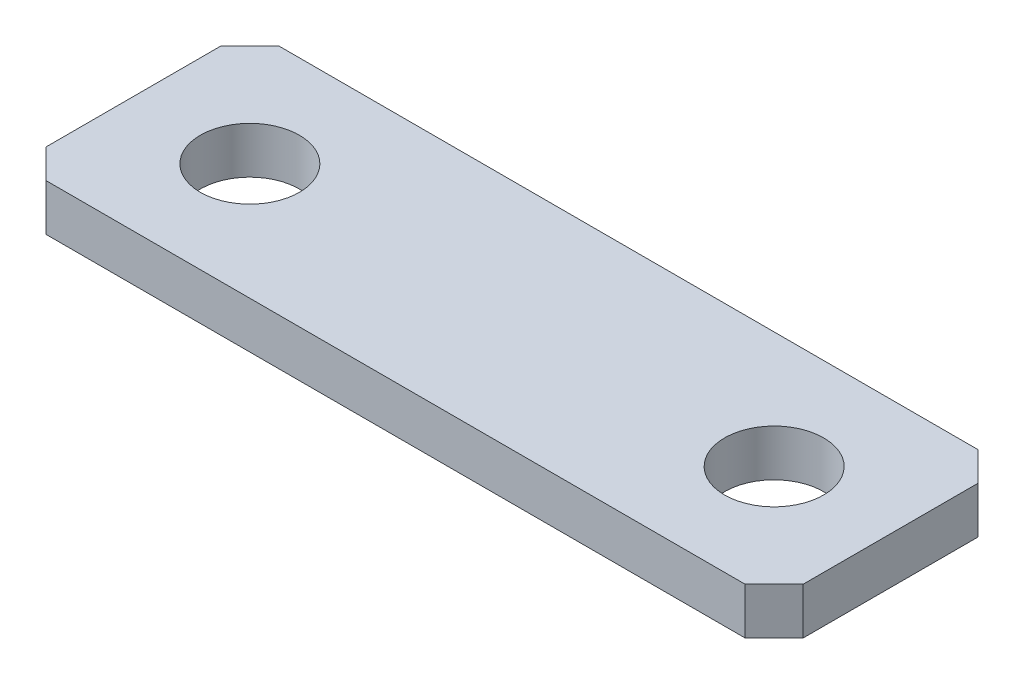
ISO-10303-21;
HEADER;
FILE_DESCRIPTION(('STEP AP214'),'2;1');
FILE_NAME('part.step','',(''),(''),'','','');
FILE_SCHEMA(('AUTOMOTIVE_DESIGN { 1 0 10303 214 1 1 1 1 }'));
ENDSEC;
DATA;
#1=APPLICATION_CONTEXT('core data for automotive mechanical design processes');
#2=APPLICATION_PROTOCOL_DEFINITION('international standard','automotive_design',2000,#1);
#3=PRODUCT_CONTEXT('',#1,'mechanical');
#4=PRODUCT('Part','Part','',(#3));
#5=PRODUCT_RELATED_PRODUCT_CATEGORY('part','',(#4));
#6=PRODUCT_DEFINITION_FORMATION('','',#4);
#7=PRODUCT_DEFINITION_CONTEXT('part definition',#1,'design');
#8=PRODUCT_DEFINITION('design','',#6,#7);
#9=PRODUCT_DEFINITION_SHAPE('','',#8);
#10=(LENGTH_UNIT() NAMED_UNIT(*) SI_UNIT(.MILLI.,.METRE.));
#11=(NAMED_UNIT(*) PLANE_ANGLE_UNIT() SI_UNIT($,.RADIAN.));
#12=(NAMED_UNIT(*) SI_UNIT($,.STERADIAN.) SOLID_ANGLE_UNIT());
#13=UNCERTAINTY_MEASURE_WITH_UNIT(LENGTH_MEASURE(1.E-05),#10,'distance_accuracy_value','');
#14=(GEOMETRIC_REPRESENTATION_CONTEXT(3) GLOBAL_UNCERTAINTY_ASSIGNED_CONTEXT((#13)) GLOBAL_UNIT_ASSIGNED_CONTEXT((#10,
#11,#12)) REPRESENTATION_CONTEXT('',''));
#15=CARTESIAN_POINT('',(0.,0.,0.));
#16=DIRECTION('',(0.,0.,1.));
#17=DIRECTION('',(1.,0.,0.));
#18=AXIS2_PLACEMENT_3D('',#15,#16,#17);
#19=CARTESIAN_POINT('',(0.,8.,0.));
#20=DIRECTION('',(0.,-1.,0.));
#21=DIRECTION('',(0.,0.,-1.));
#22=AXIS2_PLACEMENT_3D('',#19,#20,#21);
#23=PLANE('',#22);
#24=CARTESIAN_POINT('',(20.,8.,-20.));
#25=DIRECTION('',(0.,1.,0.));
#26=DIRECTION('',(0.,0.,1.));
#27=AXIS2_PLACEMENT_3D('',#24,#25,#26);
#28=CIRCLE('',#27,8.5);
#29=CARTESIAN_POINT('',(20.,8.,-11.5));
#30=VERTEX_POINT('',#29);
#31=EDGE_CURVE('E128',#30,#30,#28,.T.);
#32=ORIENTED_EDGE('',*,*,#31,.F.);
#33=EDGE_LOOP('',(#32));
#34=FACE_BOUND('',#33,.T.);
#35=DIRECTION('',(-1.,0.,0.));
#36=VECTOR('',#35,1.);
#37=CARTESIAN_POINT('',(0.,8.,-40.));
#38=LINE('',#37,#36);
#39=CARTESIAN_POINT('',(125.,8.,-40.));
#40=VERTEX_POINT('',#39);
#41=CARTESIAN_POINT('',(5.00000000000002,8.,-40.));
#42=VERTEX_POINT('',#41);
#43=EDGE_CURVE('E137',#40,#42,#38,.T.);
#44=ORIENTED_EDGE('',*,*,#43,.T.);
#45=DIRECTION('',(0.70710678118655,0.,-0.707106781186546));
#46=VECTOR('',#45,1.);
#47=CARTESIAN_POINT('',(0.,8.,-35.));
#48=LINE('',#47,#46);
#49=CARTESIAN_POINT('',(0.,8.,-35.));
#50=VERTEX_POINT('',#49);
#51=EDGE_CURVE('E156',#42,#50,#48,.F.);
#52=ORIENTED_EDGE('',*,*,#51,.T.);
#53=DIRECTION('',(0.,0.,1.));
#54=VECTOR('',#53,1.);
#55=CARTESIAN_POINT('',(0.,8.,0.));
#56=LINE('',#55,#54);
#57=CARTESIAN_POINT('',(0.,8.,-5.00000000000003));
#58=VERTEX_POINT('',#57);
#59=EDGE_CURVE('E120',#50,#58,#56,.T.);
#60=ORIENTED_EDGE('',*,*,#59,.T.);
#61=DIRECTION('',(-0.707106781186547,0.,-0.707106781186549));
#62=VECTOR('',#61,1.);
#63=CARTESIAN_POINT('',(5.00000000000002,8.,0.));
#64=LINE('',#63,#62);
#65=CARTESIAN_POINT('',(5.00000000000002,8.,0.));
#66=VERTEX_POINT('',#65);
#67=EDGE_CURVE('E151',#58,#66,#64,.F.);
#68=ORIENTED_EDGE('',*,*,#67,.T.);
#69=DIRECTION('',(1.,0.,0.));
#70=VECTOR('',#69,1.);
#71=CARTESIAN_POINT('',(0.,8.,0.));
#72=LINE('',#71,#70);
#73=CARTESIAN_POINT('',(125.,8.,0.));
#74=VERTEX_POINT('',#73);
#75=EDGE_CURVE('E167',#66,#74,#72,.T.);
#76=ORIENTED_EDGE('',*,*,#75,.T.);
#77=DIRECTION('',(-0.707106781186549,0.,0.707106781186547));
#78=VECTOR('',#77,1.);
#79=CARTESIAN_POINT('',(130.,8.,-5.00000000000002));
#80=LINE('',#79,#78);
#81=CARTESIAN_POINT('',(130.,8.,-5.00000000000002));
#82=VERTEX_POINT('',#81);
#83=EDGE_CURVE('E56',#74,#82,#80,.F.);
#84=ORIENTED_EDGE('',*,*,#83,.T.);
#85=DIRECTION('',(0.,0.,-1.));
#86=VECTOR('',#85,1.);
#87=CARTESIAN_POINT('',(130.,8.,0.));
#88=LINE('',#87,#86);
#89=CARTESIAN_POINT('',(130.,8.,-35.));
#90=VERTEX_POINT('',#89);
#91=EDGE_CURVE('E175',#82,#90,#88,.T.);
#92=ORIENTED_EDGE('',*,*,#91,.T.);
#93=DIRECTION('',(0.707106781186545,0.,0.70710678118655));
#94=VECTOR('',#93,1.);
#95=CARTESIAN_POINT('',(125.,8.,-40.));
#96=LINE('',#95,#94);
#97=EDGE_CURVE('E154',#90,#40,#96,.F.);
#98=ORIENTED_EDGE('',*,*,#97,.T.);
#99=EDGE_LOOP('',(#44,#52,#60,#68,#76,#84,#92,#98));
#100=FACE_BOUND('',#99,.T.);
#101=CARTESIAN_POINT('',(110.,8.,-20.));
#102=DIRECTION('',(0.,1.,0.));
#103=DIRECTION('',(0.,0.,1.));
#104=AXIS2_PLACEMENT_3D('',#101,#102,#103);
#105=CIRCLE('',#104,8.50000000000001);
#106=CARTESIAN_POINT('',(110.,8.,-11.5));
#107=VERTEX_POINT('',#106);
#108=EDGE_CURVE('E182',#107,#107,#105,.T.);
#109=ORIENTED_EDGE('',*,*,#108,.F.);
#110=EDGE_LOOP('',(#109));
#111=FACE_BOUND('',#110,.T.);
#112=ADVANCED_FACE('F34',(#34,#100,#111),#23,.F.);
#113=CARTESIAN_POINT('',(0.,0.,0.));
#114=DIRECTION('',(0.,-1.,0.));
#115=DIRECTION('',(0.,0.,-1.));
#116=AXIS2_PLACEMENT_3D('',#113,#114,#115);
#117=PLANE('',#116);
#118=CARTESIAN_POINT('',(20.,0.,-20.));
#119=DIRECTION('',(0.,1.,0.));
#120=DIRECTION('',(0.,0.,1.));
#121=AXIS2_PLACEMENT_3D('',#118,#119,#120);
#122=CIRCLE('',#121,8.5);
#123=CARTESIAN_POINT('',(20.,0.,-11.5));
#124=VERTEX_POINT('',#123);
#125=EDGE_CURVE('E134',#124,#124,#122,.T.);
#126=ORIENTED_EDGE('',*,*,#125,.T.);
#127=EDGE_LOOP('',(#126));
#128=FACE_BOUND('',#127,.T.);
#129=DIRECTION('',(0.,0.,1.));
#130=VECTOR('',#129,1.);
#131=CARTESIAN_POINT('',(0.,0.,0.));
#132=LINE('',#131,#130);
#133=CARTESIAN_POINT('',(0.,0.,-35.));
#134=VERTEX_POINT('',#133);
#135=CARTESIAN_POINT('',(0.,0.,-5.00000000000003));
#136=VERTEX_POINT('',#135);
#137=EDGE_CURVE('E117',#134,#136,#132,.T.);
#138=ORIENTED_EDGE('',*,*,#137,.F.);
#139=DIRECTION('',(-0.70710678118655,0.,0.707106781186546));
#140=VECTOR('',#139,1.);
#141=CARTESIAN_POINT('',(-17.5,0.,-17.5000000000001));
#142=LINE('',#141,#140);
#143=CARTESIAN_POINT('',(5.00000000000002,0.,-40.));
#144=VERTEX_POINT('',#143);
#145=EDGE_CURVE('E100',#134,#144,#142,.F.);
#146=ORIENTED_EDGE('',*,*,#145,.T.);
#147=DIRECTION('',(-1.,0.,0.));
#148=VECTOR('',#147,1.);
#149=CARTESIAN_POINT('',(0.,0.,-40.));
#150=LINE('',#149,#148);
#151=CARTESIAN_POINT('',(125.,0.,-40.));
#152=VERTEX_POINT('',#151);
#153=EDGE_CURVE('E141',#152,#144,#150,.T.);
#154=ORIENTED_EDGE('',*,*,#153,.F.);
#155=DIRECTION('',(-0.707106781186545,0.,-0.70710678118655));
#156=VECTOR('',#155,1.);
#157=CARTESIAN_POINT('',(82.5000000000005,0.,-82.4999999999999));
#158=LINE('',#157,#156);
#159=CARTESIAN_POINT('',(130.,0.,-35.));
#160=VERTEX_POINT('',#159);
#161=EDGE_CURVE('E111',#152,#160,#158,.F.);
#162=ORIENTED_EDGE('',*,*,#161,.T.);
#163=DIRECTION('',(0.,0.,-1.));
#164=VECTOR('',#163,1.);
#165=CARTESIAN_POINT('',(130.,0.,0.));
#166=LINE('',#165,#164);
#167=CARTESIAN_POINT('',(130.,0.,-5.00000000000004));
#168=VERTEX_POINT('',#167);
#169=EDGE_CURVE('E131',#168,#160,#166,.T.);
#170=ORIENTED_EDGE('',*,*,#169,.F.);
#171=DIRECTION('',(0.707106781186549,0.,-0.707106781186547));
#172=VECTOR('',#171,1.);
#173=CARTESIAN_POINT('',(62.4999999999998,0.,62.5));
#174=LINE('',#173,#172);
#175=CARTESIAN_POINT('',(125.,0.,0.));
#176=VERTEX_POINT('',#175);
#177=EDGE_CURVE('E145',#168,#176,#174,.F.);
#178=ORIENTED_EDGE('',*,*,#177,.T.);
#179=DIRECTION('',(1.,0.,0.));
#180=VECTOR('',#179,1.);
#181=CARTESIAN_POINT('',(0.,0.,0.));
#182=LINE('',#181,#180);
#183=CARTESIAN_POINT('',(5.00000000000002,0.,0.));
#184=VERTEX_POINT('',#183);
#185=EDGE_CURVE('E127',#184,#176,#182,.T.);
#186=ORIENTED_EDGE('',*,*,#185,.F.);
#187=DIRECTION('',(0.707106781186547,0.,0.707106781186549));
#188=VECTOR('',#187,1.);
#189=CARTESIAN_POINT('',(2.50000000000002,0.,-2.50000000000001));
#190=LINE('',#189,#188);
#191=EDGE_CURVE('E121',#184,#136,#190,.F.);
#192=ORIENTED_EDGE('',*,*,#191,.T.);
#193=EDGE_LOOP('',(#138,#146,#154,#162,#170,#178,#186,#192));
#194=FACE_BOUND('',#193,.T.);
#195=CARTESIAN_POINT('',(110.,0.,-20.));
#196=DIRECTION('',(0.,1.,0.));
#197=DIRECTION('',(0.,0.,1.));
#198=AXIS2_PLACEMENT_3D('',#195,#196,#197);
#199=CIRCLE('',#198,8.50000000000001);
#200=CARTESIAN_POINT('',(110.,0.,-11.5));
#201=VERTEX_POINT('',#200);
#202=EDGE_CURVE('E184',#201,#201,#199,.T.);
#203=ORIENTED_EDGE('',*,*,#202,.T.);
#204=EDGE_LOOP('',(#203));
#205=FACE_BOUND('',#204,.T.);
#206=ADVANCED_FACE('F124',(#128,#194,#205),#117,.T.);
#207=CARTESIAN_POINT('',(0.,8.,0.));
#208=DIRECTION('',(1.,0.,0.));
#209=DIRECTION('',(0.,0.,-1.));
#210=AXIS2_PLACEMENT_3D('',#207,#208,#209);
#211=PLANE('',#210);
#212=ORIENTED_EDGE('',*,*,#59,.F.);
#213=DIRECTION('',(0.,-1.,0.));
#214=VECTOR('',#213,1.);
#215=CARTESIAN_POINT('',(0.,8.,-35.));
#216=LINE('',#215,#214);
#217=EDGE_CURVE('E104',#50,#134,#216,.T.);
#218=ORIENTED_EDGE('',*,*,#217,.T.);
#219=ORIENTED_EDGE('',*,*,#137,.T.);
#220=DIRECTION('',(0.,1.,0.));
#221=VECTOR('',#220,1.);
#222=CARTESIAN_POINT('',(0.,8.,-5.00000000000003));
#223=LINE('',#222,#221);
#224=EDGE_CURVE('E122',#136,#58,#223,.T.);
#225=ORIENTED_EDGE('',*,*,#224,.T.);
#226=EDGE_LOOP('',(#212,#218,#219,#225));
#227=FACE_BOUND('',#226,.T.);
#228=ADVANCED_FACE('F116',(#227),#211,.F.);
#229=CARTESIAN_POINT('',(0.,8.,0.));
#230=DIRECTION('',(0.,0.,-1.));
#231=DIRECTION('',(-1.,0.,0.));
#232=AXIS2_PLACEMENT_3D('',#229,#230,#231);
#233=PLANE('',#232);
#234=ORIENTED_EDGE('',*,*,#185,.T.);
#235=DIRECTION('',(0.,1.,0.));
#236=VECTOR('',#235,1.);
#237=CARTESIAN_POINT('',(125.,8.,0.));
#238=LINE('',#237,#236);
#239=EDGE_CURVE('E11',#176,#74,#238,.T.);
#240=ORIENTED_EDGE('',*,*,#239,.T.);
#241=ORIENTED_EDGE('',*,*,#75,.F.);
#242=DIRECTION('',(0.,-1.,0.));
#243=VECTOR('',#242,1.);
#244=CARTESIAN_POINT('',(5.00000000000002,8.,0.));
#245=LINE('',#244,#243);
#246=EDGE_CURVE('E42',#66,#184,#245,.T.);
#247=ORIENTED_EDGE('',*,*,#246,.T.);
#248=EDGE_LOOP('',(#234,#240,#241,#247));
#249=FACE_BOUND('',#248,.T.);
#250=ADVANCED_FACE('F165',(#249),#233,.F.);
#251=CARTESIAN_POINT('',(130.,8.,0.));
#252=DIRECTION('',(-1.,0.,0.));
#253=DIRECTION('',(0.,0.,1.));
#254=AXIS2_PLACEMENT_3D('',#251,#252,#253);
#255=PLANE('',#254);
#256=ORIENTED_EDGE('',*,*,#169,.T.);
#257=DIRECTION('',(0.,1.,0.));
#258=VECTOR('',#257,1.);
#259=CARTESIAN_POINT('',(130.,8.,-35.));
#260=LINE('',#259,#258);
#261=EDGE_CURVE('E49',#160,#90,#260,.T.);
#262=ORIENTED_EDGE('',*,*,#261,.T.);
#263=ORIENTED_EDGE('',*,*,#91,.F.);
#264=DIRECTION('',(0.,-1.,0.));
#265=VECTOR('',#264,1.);
#266=CARTESIAN_POINT('',(130.,8.,-5.00000000000002));
#267=LINE('',#266,#265);
#268=EDGE_CURVE('E158',#82,#168,#267,.T.);
#269=ORIENTED_EDGE('',*,*,#268,.T.);
#270=EDGE_LOOP('',(#256,#262,#263,#269));
#271=FACE_BOUND('',#270,.T.);
#272=ADVANCED_FACE('F174',(#271),#255,.F.);
#273=CARTESIAN_POINT('',(0.,8.,-40.));
#274=DIRECTION('',(0.,0.,1.));
#275=DIRECTION('',(1.,0.,0.));
#276=AXIS2_PLACEMENT_3D('',#273,#274,#275);
#277=PLANE('',#276);
#278=ORIENTED_EDGE('',*,*,#153,.T.);
#279=DIRECTION('',(0.,1.,0.));
#280=VECTOR('',#279,1.);
#281=CARTESIAN_POINT('',(5.00000000000002,8.,-40.));
#282=LINE('',#281,#280);
#283=EDGE_CURVE('E105',#144,#42,#282,.T.);
#284=ORIENTED_EDGE('',*,*,#283,.T.);
#285=ORIENTED_EDGE('',*,*,#43,.F.);
#286=DIRECTION('',(0.,-1.,0.));
#287=VECTOR('',#286,1.);
#288=CARTESIAN_POINT('',(125.,8.,-40.));
#289=LINE('',#288,#287);
#290=EDGE_CURVE('E110',#40,#152,#289,.T.);
#291=ORIENTED_EDGE('',*,*,#290,.T.);
#292=EDGE_LOOP('',(#278,#284,#285,#291));
#293=FACE_BOUND('',#292,.T.);
#294=ADVANCED_FACE('F206',(#293),#277,.F.);
#295=CARTESIAN_POINT('',(20.,8.,-20.));
#296=DIRECTION('',(0.,-1.,0.));
#297=DIRECTION('',(0.,0.,-1.));
#298=AXIS2_PLACEMENT_3D('',#295,#296,#297);
#299=CYLINDRICAL_SURFACE('',#298,8.5);
#300=ORIENTED_EDGE('',*,*,#31,.T.);
#301=EDGE_LOOP('',(#300));
#302=FACE_BOUND('',#301,.T.);
#303=ORIENTED_EDGE('',*,*,#125,.F.);
#304=EDGE_LOOP('',(#303));
#305=FACE_BOUND('',#304,.T.);
#306=ADVANCED_FACE('F203',(#302,#305),#299,.F.);
#307=CARTESIAN_POINT('',(110.,8.,-20.));
#308=DIRECTION('',(0.,-1.,0.));
#309=DIRECTION('',(0.,0.,-1.));
#310=AXIS2_PLACEMENT_3D('',#307,#308,#309);
#311=CYLINDRICAL_SURFACE('',#310,8.50000000000001);
#312=ORIENTED_EDGE('',*,*,#108,.T.);
#313=EDGE_LOOP('',(#312));
#314=FACE_BOUND('',#313,.T.);
#315=ORIENTED_EDGE('',*,*,#202,.F.);
#316=EDGE_LOOP('',(#315));
#317=FACE_BOUND('',#316,.T.);
#318=ADVANCED_FACE('F190',(#314,#317),#311,.F.);
#319=CARTESIAN_POINT('',(0.,8.,-35.));
#320=DIRECTION('',(0.707106781186545,0.,0.707106781186549));
#321=DIRECTION('',(0.,-1.,0.));
#322=AXIS2_PLACEMENT_3D('',#319,#320,#321);
#323=PLANE('',#322);
#324=ORIENTED_EDGE('',*,*,#51,.F.);
#325=ORIENTED_EDGE('',*,*,#283,.F.);
#326=ORIENTED_EDGE('',*,*,#145,.F.);
#327=ORIENTED_EDGE('',*,*,#217,.F.);
#328=EDGE_LOOP('',(#324,#325,#326,#327));
#329=FACE_BOUND('',#328,.T.);
#330=ADVANCED_FACE('F103',(#329),#323,.F.);
#331=CARTESIAN_POINT('',(125.,8.,-40.));
#332=DIRECTION('',(-0.70710678118655,0.,0.707106781186545));
#333=DIRECTION('',(0.,-1.,0.));
#334=AXIS2_PLACEMENT_3D('',#331,#332,#333);
#335=PLANE('',#334);
#336=ORIENTED_EDGE('',*,*,#97,.F.);
#337=ORIENTED_EDGE('',*,*,#261,.F.);
#338=ORIENTED_EDGE('',*,*,#161,.F.);
#339=ORIENTED_EDGE('',*,*,#290,.F.);
#340=EDGE_LOOP('',(#336,#337,#338,#339));
#341=FACE_BOUND('',#340,.T.);
#342=ADVANCED_FACE('F218',(#341),#335,.F.);
#343=CARTESIAN_POINT('',(130.,8.,-5.00000000000002));
#344=DIRECTION('',(-0.707106781186546,0.,-0.707106781186548));
#345=DIRECTION('',(0.,-1.,0.));
#346=AXIS2_PLACEMENT_3D('',#343,#344,#345);
#347=PLANE('',#346);
#348=ORIENTED_EDGE('',*,*,#83,.F.);
#349=ORIENTED_EDGE('',*,*,#239,.F.);
#350=ORIENTED_EDGE('',*,*,#177,.F.);
#351=ORIENTED_EDGE('',*,*,#268,.F.);
#352=EDGE_LOOP('',(#348,#349,#350,#351));
#353=FACE_BOUND('',#352,.T.);
#354=ADVANCED_FACE('F173',(#353),#347,.F.);
#355=CARTESIAN_POINT('',(5.00000000000002,8.,0.));
#356=DIRECTION('',(0.707106781186548,0.,-0.707106781186546));
#357=DIRECTION('',(0.,-1.,0.));
#358=AXIS2_PLACEMENT_3D('',#355,#356,#357);
#359=PLANE('',#358);
#360=ORIENTED_EDGE('',*,*,#67,.F.);
#361=ORIENTED_EDGE('',*,*,#224,.F.);
#362=ORIENTED_EDGE('',*,*,#191,.F.);
#363=ORIENTED_EDGE('',*,*,#246,.F.);
#364=EDGE_LOOP('',(#360,#361,#362,#363));
#365=FACE_BOUND('',#364,.T.);
#366=ADVANCED_FACE('F36',(#365),#359,.F.);
#367=CLOSED_SHELL('',(#112,#206,#228,#250,#272,#294,#306,#318,#330,#342,#354,#366));
#368=MANIFOLD_SOLID_BREP('B2',#367);
#369=ADVANCED_BREP_SHAPE_REPRESENTATION('',(#18,#368),#14);
#370=SHAPE_DEFINITION_REPRESENTATION(#9,#369);
ENDSEC;
END-ISO-10303-21;
